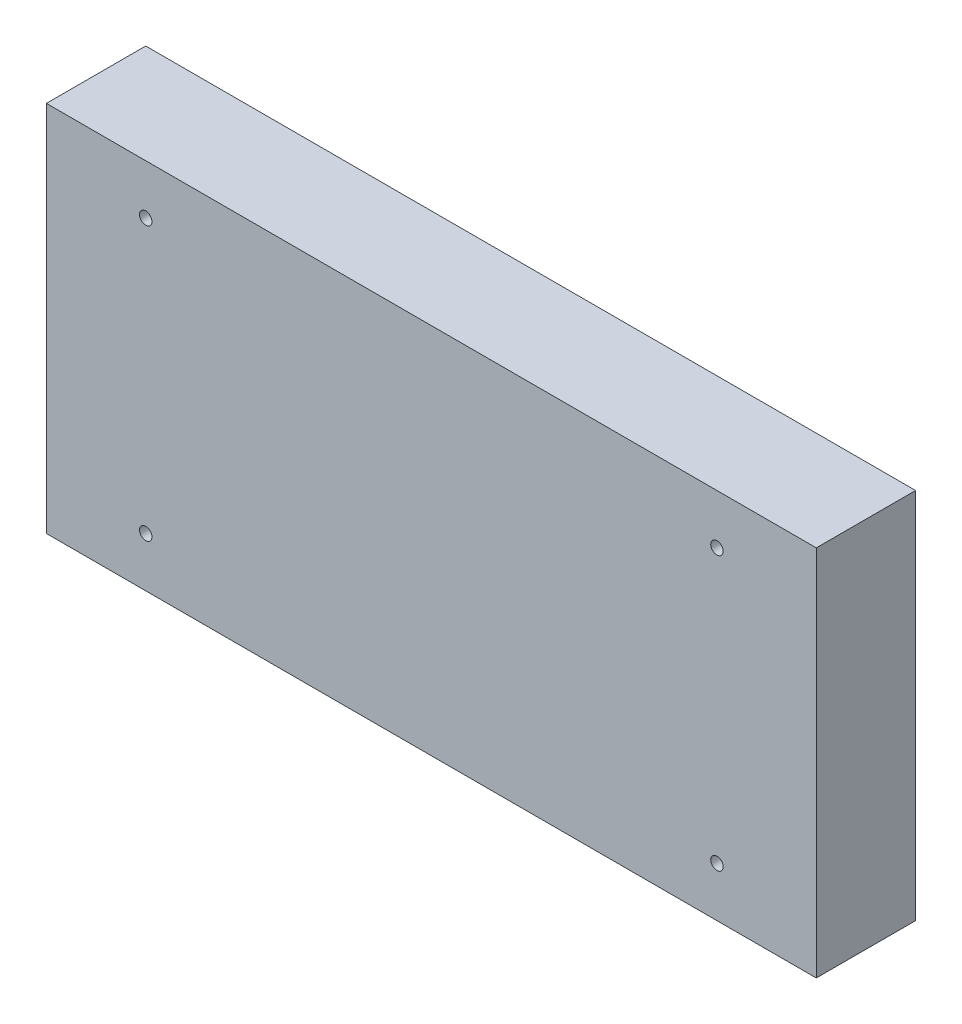
ISO-10303-21;
HEADER;
FILE_DESCRIPTION(('STEP AP214'),'2;1');
FILE_NAME('part.step','',(''),(''),'','','');
FILE_SCHEMA(('AUTOMOTIVE_DESIGN { 1 0 10303 214 1 1 1 1 }'));
ENDSEC;
DATA;
#1=APPLICATION_CONTEXT('core data for automotive mechanical design processes');
#2=APPLICATION_PROTOCOL_DEFINITION('international standard','automotive_design',2000,#1);
#3=PRODUCT_CONTEXT('',#1,'mechanical');
#4=PRODUCT('Part','Part','',(#3));
#5=PRODUCT_RELATED_PRODUCT_CATEGORY('part','',(#4));
#6=PRODUCT_DEFINITION_FORMATION('','',#4);
#7=PRODUCT_DEFINITION_CONTEXT('part definition',#1,'design');
#8=PRODUCT_DEFINITION('design','',#6,#7);
#9=PRODUCT_DEFINITION_SHAPE('','',#8);
#10=(LENGTH_UNIT() NAMED_UNIT(*) SI_UNIT(.MILLI.,.METRE.));
#11=(NAMED_UNIT(*) PLANE_ANGLE_UNIT() SI_UNIT($,.RADIAN.));
#12=(NAMED_UNIT(*) SI_UNIT($,.STERADIAN.) SOLID_ANGLE_UNIT());
#13=UNCERTAINTY_MEASURE_WITH_UNIT(LENGTH_MEASURE(1.E-05),#10,'distance_accuracy_value','');
#14=(GEOMETRIC_REPRESENTATION_CONTEXT(3) GLOBAL_UNCERTAINTY_ASSIGNED_CONTEXT((#13)) GLOBAL_UNIT_ASSIGNED_CONTEXT((#10,
#11,#12)) REPRESENTATION_CONTEXT('',''));
#15=CARTESIAN_POINT('',(0.,0.,0.));
#16=DIRECTION('',(0.,0.,1.));
#17=DIRECTION('',(1.,0.,0.));
#18=AXIS2_PLACEMENT_3D('',#15,#16,#17);
#19=CARTESIAN_POINT('',(-36.5970425916688,2.11718009478672,8.));
#20=DIRECTION('',(1.,0.,0.));
#21=DIRECTION('',(0.,0.,-1.));
#22=AXIS2_PLACEMENT_3D('',#19,#20,#21);
#23=PLANE('',#22);
#24=DIRECTION('',(0.,-1.,0.));
#25=VECTOR('',#24,1.);
#26=CARTESIAN_POINT('',(-36.5970425916688,2.11718009478672,0.));
#27=LINE('',#26,#25);
#28=CARTESIAN_POINT('',(-36.5970425916688,2.11718009478672,0.));
#29=VERTEX_POINT('',#28);
#30=CARTESIAN_POINT('',(-36.5970425916688,-27.8828199052133,0.));
#31=VERTEX_POINT('',#30);
#32=EDGE_CURVE('E98',#29,#31,#27,.T.);
#33=ORIENTED_EDGE('',*,*,#32,.T.);
#34=DIRECTION('',(0.,0.,-1.));
#35=VECTOR('',#34,1.);
#36=CARTESIAN_POINT('',(-36.5970425916688,-27.8828199052133,8.));
#37=LINE('',#36,#35);
#38=CARTESIAN_POINT('',(-36.5970425916688,-27.8828199052133,8.));
#39=VERTEX_POINT('',#38);
#40=EDGE_CURVE('E11',#39,#31,#37,.T.);
#41=ORIENTED_EDGE('',*,*,#40,.F.);
#42=DIRECTION('',(0.,-1.,0.));
#43=VECTOR('',#42,1.);
#44=CARTESIAN_POINT('',(-36.5970425916688,2.11718009478672,8.));
#45=LINE('',#44,#43);
#46=CARTESIAN_POINT('',(-36.5970425916688,2.11718009478672,8.));
#47=VERTEX_POINT('',#46);
#48=EDGE_CURVE('E85',#47,#39,#45,.T.);
#49=ORIENTED_EDGE('',*,*,#48,.F.);
#50=DIRECTION('',(0.,0.,-1.));
#51=VECTOR('',#50,1.);
#52=CARTESIAN_POINT('',(-36.5970425916688,2.11718009478672,8.));
#53=LINE('',#52,#51);
#54=EDGE_CURVE('E94',#47,#29,#53,.T.);
#55=ORIENTED_EDGE('',*,*,#54,.T.);
#56=EDGE_LOOP('',(#33,#41,#49,#55));
#57=FACE_BOUND('',#56,.T.);
#58=ADVANCED_FACE('F32',(#57),#23,.F.);
#59=CARTESIAN_POINT('',(-36.5970425916688,-27.8828199052133,8.));
#60=DIRECTION('',(0.,1.,0.));
#61=DIRECTION('',(0.,0.,1.));
#62=AXIS2_PLACEMENT_3D('',#59,#60,#61);
#63=PLANE('',#62);
#64=DIRECTION('',(1.,0.,0.));
#65=VECTOR('',#64,1.);
#66=CARTESIAN_POINT('',(-36.5970425916688,-27.8828199052133,0.));
#67=LINE('',#66,#65);
#68=CARTESIAN_POINT('',(25.4029574083312,-27.8828199052133,0.));
#69=VERTEX_POINT('',#68);
#70=EDGE_CURVE('E89',#31,#69,#67,.T.);
#71=ORIENTED_EDGE('',*,*,#70,.T.);
#72=DIRECTION('',(0.,0.,-1.));
#73=VECTOR('',#72,1.);
#74=CARTESIAN_POINT('',(25.4029574083312,-27.8828199052133,8.));
#75=LINE('',#74,#73);
#76=CARTESIAN_POINT('',(25.4029574083312,-27.8828199052133,8.));
#77=VERTEX_POINT('',#76);
#78=EDGE_CURVE('E41',#77,#69,#75,.T.);
#79=ORIENTED_EDGE('',*,*,#78,.F.);
#80=DIRECTION('',(1.,0.,0.));
#81=VECTOR('',#80,1.);
#82=CARTESIAN_POINT('',(-36.5970425916688,-27.8828199052133,8.));
#83=LINE('',#82,#81);
#84=EDGE_CURVE('E80',#39,#77,#83,.T.);
#85=ORIENTED_EDGE('',*,*,#84,.F.);
#86=ORIENTED_EDGE('',*,*,#40,.T.);
#87=EDGE_LOOP('',(#71,#79,#85,#86));
#88=FACE_BOUND('',#87,.T.);
#89=ADVANCED_FACE('F88',(#88),#63,.F.);
#90=CARTESIAN_POINT('',(25.4029574083312,2.11718009478672,8.));
#91=DIRECTION('',(-1.,0.,0.));
#92=DIRECTION('',(0.,-1.,0.));
#93=AXIS2_PLACEMENT_3D('',#90,#91,#92);
#94=PLANE('',#93);
#95=DIRECTION('',(0.,1.,0.));
#96=VECTOR('',#95,1.);
#97=CARTESIAN_POINT('',(25.4029574083312,2.11718009478672,0.));
#98=LINE('',#97,#96);
#99=CARTESIAN_POINT('',(25.4029574083312,2.11718009478672,0.));
#100=VERTEX_POINT('',#99);
#101=EDGE_CURVE('E67',#69,#100,#98,.T.);
#102=ORIENTED_EDGE('',*,*,#101,.T.);
#103=DIRECTION('',(0.,0.,-1.));
#104=VECTOR('',#103,1.);
#105=CARTESIAN_POINT('',(25.4029574083312,2.11718009478672,8.));
#106=LINE('',#105,#104);
#107=CARTESIAN_POINT('',(25.4029574083312,2.11718009478672,8.));
#108=VERTEX_POINT('',#107);
#109=EDGE_CURVE('E90',#108,#100,#106,.T.);
#110=ORIENTED_EDGE('',*,*,#109,.F.);
#111=DIRECTION('',(0.,1.,0.));
#112=VECTOR('',#111,1.);
#113=CARTESIAN_POINT('',(25.4029574083312,2.11718009478672,8.));
#114=LINE('',#113,#112);
#115=EDGE_CURVE('E83',#77,#108,#114,.T.);
#116=ORIENTED_EDGE('',*,*,#115,.F.);
#117=ORIENTED_EDGE('',*,*,#78,.T.);
#118=EDGE_LOOP('',(#102,#110,#116,#117));
#119=FACE_BOUND('',#118,.T.);
#120=ADVANCED_FACE('F92',(#119),#94,.F.);
#121=CARTESIAN_POINT('',(-36.5970425916688,2.11718009478672,8.));
#122=DIRECTION('',(0.,-1.,0.));
#123=DIRECTION('',(0.,0.,-1.));
#124=AXIS2_PLACEMENT_3D('',#121,#122,#123);
#125=PLANE('',#124);
#126=DIRECTION('',(-1.,0.,0.));
#127=VECTOR('',#126,1.);
#128=CARTESIAN_POINT('',(-36.5970425916688,2.11718009478672,0.));
#129=LINE('',#128,#127);
#130=EDGE_CURVE('E73',#100,#29,#129,.T.);
#131=ORIENTED_EDGE('',*,*,#130,.T.);
#132=ORIENTED_EDGE('',*,*,#54,.F.);
#133=DIRECTION('',(-1.,0.,0.));
#134=VECTOR('',#133,1.);
#135=CARTESIAN_POINT('',(-36.5970425916688,2.11718009478672,8.));
#136=LINE('',#135,#134);
#137=EDGE_CURVE('E50',#108,#47,#136,.T.);
#138=ORIENTED_EDGE('',*,*,#137,.F.);
#139=ORIENTED_EDGE('',*,*,#109,.T.);
#140=EDGE_LOOP('',(#131,#132,#138,#139));
#141=FACE_BOUND('',#140,.T.);
#142=ADVANCED_FACE('F136',(#141),#125,.F.);
#143=CARTESIAN_POINT('',(0.,0.,8.));
#144=DIRECTION('',(0.,0.,1.));
#145=DIRECTION('',(1.,0.,0.));
#146=AXIS2_PLACEMENT_3D('',#143,#144,#145);
#147=PLANE('',#146);
#148=CARTESIAN_POINT('',(17.4029574083312,-23.8828199052133,8.));
#149=DIRECTION('',(0.,0.,1.));
#150=DIRECTION('',(-1.,0.,0.));
#151=AXIS2_PLACEMENT_3D('',#148,#149,#150);
#152=CIRCLE('',#151,0.499999999999999);
#153=CARTESIAN_POINT('',(16.9029574083312,-23.8828199052133,8.));
#154=VERTEX_POINT('',#153);
#155=EDGE_CURVE('E125',#154,#154,#152,.T.);
#156=ORIENTED_EDGE('',*,*,#155,.F.);
#157=EDGE_LOOP('',(#156));
#158=FACE_BOUND('',#157,.T.);
#159=CARTESIAN_POINT('',(17.4029574083312,-1.88281990521329,8.));
#160=DIRECTION('',(0.,0.,1.));
#161=DIRECTION('',(-1.,0.,0.));
#162=AXIS2_PLACEMENT_3D('',#159,#160,#161);
#163=CIRCLE('',#162,0.499999999999999);
#164=CARTESIAN_POINT('',(16.9029574083312,-1.88281990521329,8.));
#165=VERTEX_POINT('',#164);
#166=EDGE_CURVE('E115',#165,#165,#163,.T.);
#167=ORIENTED_EDGE('',*,*,#166,.F.);
#168=EDGE_LOOP('',(#167));
#169=FACE_BOUND('',#168,.T.);
#170=CARTESIAN_POINT('',(-28.5970425916688,-23.8828199052133,8.));
#171=DIRECTION('',(0.,0.,1.));
#172=DIRECTION('',(1.,0.,0.));
#173=AXIS2_PLACEMENT_3D('',#170,#171,#172);
#174=CIRCLE('',#173,0.499999999999999);
#175=CARTESIAN_POINT('',(-28.0970425916688,-23.8828199052133,8.));
#176=VERTEX_POINT('',#175);
#177=EDGE_CURVE('E112',#176,#176,#174,.T.);
#178=ORIENTED_EDGE('',*,*,#177,.F.);
#179=EDGE_LOOP('',(#178));
#180=FACE_BOUND('',#179,.T.);
#181=CARTESIAN_POINT('',(-28.5970425916688,-1.88281990521329,8.));
#182=DIRECTION('',(0.,0.,1.));
#183=DIRECTION('',(1.,0.,0.));
#184=AXIS2_PLACEMENT_3D('',#181,#182,#183);
#185=CIRCLE('',#184,0.499999999999999);
#186=CARTESIAN_POINT('',(-28.0970425916688,-1.88281990521329,8.));
#187=VERTEX_POINT('',#186);
#188=EDGE_CURVE('E109',#187,#187,#185,.T.);
#189=ORIENTED_EDGE('',*,*,#188,.F.);
#190=EDGE_LOOP('',(#189));
#191=FACE_BOUND('',#190,.T.);
#192=ORIENTED_EDGE('',*,*,#48,.T.);
#193=ORIENTED_EDGE('',*,*,#84,.T.);
#194=ORIENTED_EDGE('',*,*,#115,.T.);
#195=ORIENTED_EDGE('',*,*,#137,.T.);
#196=EDGE_LOOP('',(#192,#193,#194,#195));
#197=FACE_BOUND('',#196,.T.);
#198=ADVANCED_FACE('F81',(#158,#169,#180,#191,#197),#147,.T.);
#199=CARTESIAN_POINT('',(0.,0.,0.));
#200=DIRECTION('',(0.,0.,1.));
#201=DIRECTION('',(1.,0.,0.));
#202=AXIS2_PLACEMENT_3D('',#199,#200,#201);
#203=PLANE('',#202);
#204=CARTESIAN_POINT('',(17.4029574083312,-23.8828199052133,0.));
#205=DIRECTION('',(0.,0.,1.));
#206=DIRECTION('',(1.,0.,0.));
#207=AXIS2_PLACEMENT_3D('',#204,#205,#206);
#208=CIRCLE('',#207,0.499999999999999);
#209=CARTESIAN_POINT('',(17.9029574083312,-23.8828199052133,0.));
#210=VERTEX_POINT('',#209);
#211=EDGE_CURVE('E35',#210,#210,#208,.T.);
#212=ORIENTED_EDGE('',*,*,#211,.T.);
#213=EDGE_LOOP('',(#212));
#214=FACE_BOUND('',#213,.T.);
#215=CARTESIAN_POINT('',(17.4029574083312,-1.88281990521329,0.));
#216=DIRECTION('',(0.,0.,1.));
#217=DIRECTION('',(1.,0.,0.));
#218=AXIS2_PLACEMENT_3D('',#215,#216,#217);
#219=CIRCLE('',#218,0.499999999999999);
#220=CARTESIAN_POINT('',(17.9029574083312,-1.88281990521329,0.));
#221=VERTEX_POINT('',#220);
#222=EDGE_CURVE('E113',#221,#221,#219,.T.);
#223=ORIENTED_EDGE('',*,*,#222,.T.);
#224=EDGE_LOOP('',(#223));
#225=FACE_BOUND('',#224,.T.);
#226=CARTESIAN_POINT('',(-28.5970425916688,-23.8828199052133,0.));
#227=DIRECTION('',(0.,0.,1.));
#228=DIRECTION('',(1.,0.,0.));
#229=AXIS2_PLACEMENT_3D('',#226,#227,#228);
#230=CIRCLE('',#229,0.499999999999999);
#231=CARTESIAN_POINT('',(-28.0970425916688,-23.8828199052133,0.));
#232=VERTEX_POINT('',#231);
#233=EDGE_CURVE('E110',#232,#232,#230,.T.);
#234=ORIENTED_EDGE('',*,*,#233,.T.);
#235=EDGE_LOOP('',(#234));
#236=FACE_BOUND('',#235,.T.);
#237=CARTESIAN_POINT('',(-28.5970425916688,-1.88281990521329,0.));
#238=DIRECTION('',(0.,0.,1.));
#239=DIRECTION('',(1.,0.,0.));
#240=AXIS2_PLACEMENT_3D('',#237,#238,#239);
#241=CIRCLE('',#240,0.499999999999999);
#242=CARTESIAN_POINT('',(-28.0970425916688,-1.88281990521329,0.));
#243=VERTEX_POINT('',#242);
#244=EDGE_CURVE('E101',#243,#243,#241,.T.);
#245=ORIENTED_EDGE('',*,*,#244,.T.);
#246=EDGE_LOOP('',(#245));
#247=FACE_BOUND('',#246,.T.);
#248=ORIENTED_EDGE('',*,*,#32,.F.);
#249=ORIENTED_EDGE('',*,*,#130,.F.);
#250=ORIENTED_EDGE('',*,*,#101,.F.);
#251=ORIENTED_EDGE('',*,*,#70,.F.);
#252=EDGE_LOOP('',(#248,#249,#250,#251));
#253=FACE_BOUND('',#252,.T.);
#254=ADVANCED_FACE('F135',(#214,#225,#236,#247,#253),#203,.F.);
#255=CARTESIAN_POINT('',(-28.5970425916688,-1.88281990521329,-2.));
#256=DIRECTION('',(0.,0.,1.));
#257=DIRECTION('',(1.,0.,0.));
#258=AXIS2_PLACEMENT_3D('',#255,#256,#257);
#259=CYLINDRICAL_SURFACE('',#258,0.499999999999999);
#260=ORIENTED_EDGE('',*,*,#188,.T.);
#261=EDGE_LOOP('',(#260));
#262=FACE_BOUND('',#261,.T.);
#263=ORIENTED_EDGE('',*,*,#244,.F.);
#264=EDGE_LOOP('',(#263));
#265=FACE_BOUND('',#264,.T.);
#266=ADVANCED_FACE('F131',(#262,#265),#259,.F.);
#267=CARTESIAN_POINT('',(-28.5970425916688,-23.8828199052133,-2.));
#268=DIRECTION('',(0.,0.,1.));
#269=DIRECTION('',(1.,0.,0.));
#270=AXIS2_PLACEMENT_3D('',#267,#268,#269);
#271=CYLINDRICAL_SURFACE('',#270,0.499999999999999);
#272=ORIENTED_EDGE('',*,*,#177,.T.);
#273=EDGE_LOOP('',(#272));
#274=FACE_BOUND('',#273,.T.);
#275=ORIENTED_EDGE('',*,*,#233,.F.);
#276=EDGE_LOOP('',(#275));
#277=FACE_BOUND('',#276,.T.);
#278=ADVANCED_FACE('F185',(#274,#277),#271,.F.);
#279=CARTESIAN_POINT('',(17.4029574083312,-1.88281990521329,-2.));
#280=DIRECTION('',(0.,0.,1.));
#281=DIRECTION('',(1.,0.,0.));
#282=AXIS2_PLACEMENT_3D('',#279,#280,#281);
#283=CYLINDRICAL_SURFACE('',#282,0.499999999999999);
#284=ORIENTED_EDGE('',*,*,#166,.T.);
#285=EDGE_LOOP('',(#284));
#286=FACE_BOUND('',#285,.T.);
#287=ORIENTED_EDGE('',*,*,#222,.F.);
#288=EDGE_LOOP('',(#287));
#289=FACE_BOUND('',#288,.T.);
#290=ADVANCED_FACE('F193',(#286,#289),#283,.F.);
#291=CARTESIAN_POINT('',(17.4029574083312,-23.8828199052133,-2.));
#292=DIRECTION('',(0.,0.,1.));
#293=DIRECTION('',(1.,0.,0.));
#294=AXIS2_PLACEMENT_3D('',#291,#292,#293);
#295=CYLINDRICAL_SURFACE('',#294,0.499999999999999);
#296=ORIENTED_EDGE('',*,*,#155,.T.);
#297=EDGE_LOOP('',(#296));
#298=FACE_BOUND('',#297,.T.);
#299=ORIENTED_EDGE('',*,*,#211,.F.);
#300=EDGE_LOOP('',(#299));
#301=FACE_BOUND('',#300,.T.);
#302=ADVANCED_FACE('F203',(#298,#301),#295,.F.);
#303=CLOSED_SHELL('',(#58,#89,#120,#142,#198,#254,#266,#278,#290,#302));
#304=MANIFOLD_SOLID_BREP('B2',#303);
#305=ADVANCED_BREP_SHAPE_REPRESENTATION('',(#18,#304),#14);
#306=SHAPE_DEFINITION_REPRESENTATION(#9,#305);
ENDSEC;
END-ISO-10303-21;
